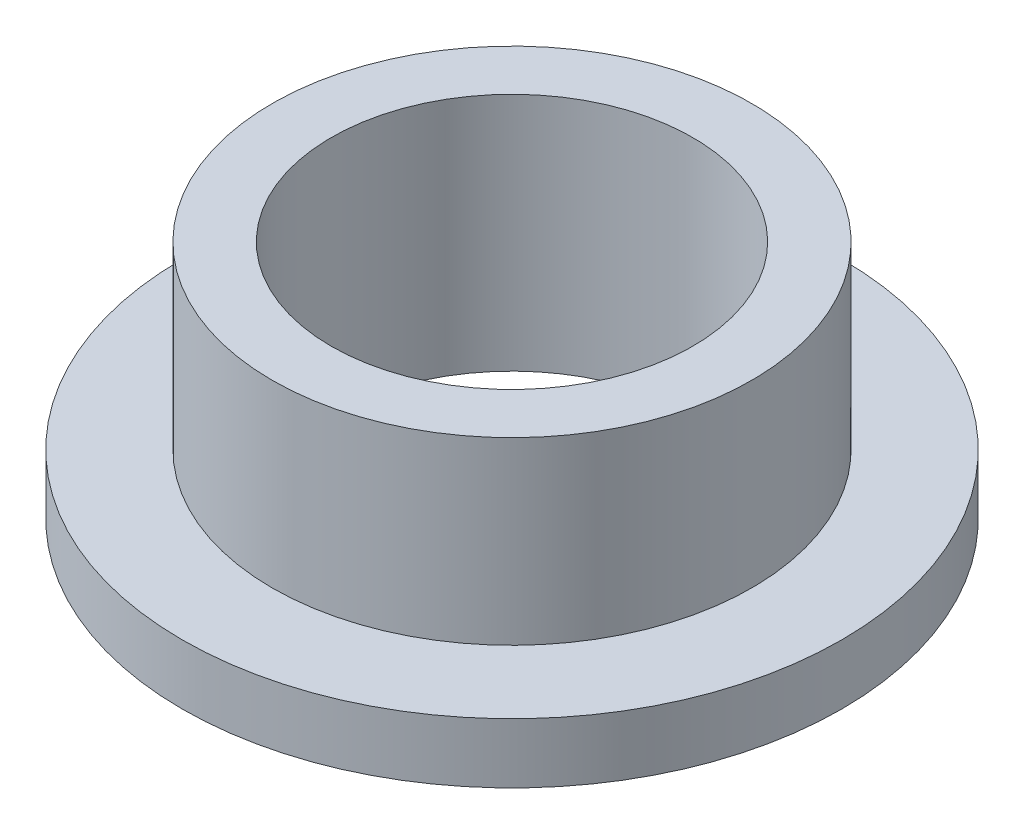
ISO-10303-21;
HEADER;
FILE_DESCRIPTION(('STEP AP214'),'2;1');
FILE_NAME('part.step','',(''),(''),'','','');
FILE_SCHEMA(('AUTOMOTIVE_DESIGN { 1 0 10303 214 1 1 1 1 }'));
ENDSEC;
DATA;
#1=APPLICATION_CONTEXT('core data for automotive mechanical design processes');
#2=APPLICATION_PROTOCOL_DEFINITION('international standard','automotive_design',2000,#1);
#3=PRODUCT_CONTEXT('',#1,'mechanical');
#4=PRODUCT('Part','Part','',(#3));
#5=PRODUCT_RELATED_PRODUCT_CATEGORY('part','',(#4));
#6=PRODUCT_DEFINITION_FORMATION('','',#4);
#7=PRODUCT_DEFINITION_CONTEXT('part definition',#1,'design');
#8=PRODUCT_DEFINITION('design','',#6,#7);
#9=PRODUCT_DEFINITION_SHAPE('','',#8);
#10=(LENGTH_UNIT() NAMED_UNIT(*) SI_UNIT(.MILLI.,.METRE.));
#11=(NAMED_UNIT(*) PLANE_ANGLE_UNIT() SI_UNIT($,.RADIAN.));
#12=(NAMED_UNIT(*) SI_UNIT($,.STERADIAN.) SOLID_ANGLE_UNIT());
#13=UNCERTAINTY_MEASURE_WITH_UNIT(LENGTH_MEASURE(1.E-05),#10,'distance_accuracy_value','');
#14=(GEOMETRIC_REPRESENTATION_CONTEXT(3) GLOBAL_UNCERTAINTY_ASSIGNED_CONTEXT((#13)) GLOBAL_UNIT_ASSIGNED_CONTEXT((#10,
#11,#12)) REPRESENTATION_CONTEXT('',''));
#15=CARTESIAN_POINT('',(0.,0.,0.));
#16=DIRECTION('',(0.,0.,1.));
#17=DIRECTION('',(1.,0.,0.));
#18=AXIS2_PLACEMENT_3D('',#15,#16,#17);
#19=CARTESIAN_POINT('',(0.,6.35,0.));
#20=DIRECTION('',(0.,1.,0.));
#21=DIRECTION('',(0.,0.,1.));
#22=AXIS2_PLACEMENT_3D('',#19,#20,#21);
#23=PLANE('',#22);
#24=CARTESIAN_POINT('',(0.,6.35,0.));
#25=DIRECTION('',(0.,1.,0.));
#26=DIRECTION('',(0.,0.,1.));
#27=AXIS2_PLACEMENT_3D('',#24,#25,#26);
#28=CIRCLE('',#27,6.35);
#29=CARTESIAN_POINT('',(0.,6.35,6.35));
#30=VERTEX_POINT('',#29);
#31=EDGE_CURVE('E10',#30,#30,#28,.T.);
#32=ORIENTED_EDGE('',*,*,#31,.T.);
#33=EDGE_LOOP('',(#32));
#34=FACE_BOUND('',#33,.T.);
#35=CARTESIAN_POINT('',(0.,6.35,0.));
#36=DIRECTION('',(0.,1.,0.));
#37=DIRECTION('',(0.,0.,1.));
#38=AXIS2_PLACEMENT_3D('',#35,#36,#37);
#39=CIRCLE('',#38,4.7879);
#40=CARTESIAN_POINT('',(0.,6.35,4.7879));
#41=VERTEX_POINT('',#40);
#42=EDGE_CURVE('E37',#41,#41,#39,.T.);
#43=ORIENTED_EDGE('',*,*,#42,.F.);
#44=EDGE_LOOP('',(#43));
#45=FACE_BOUND('',#44,.T.);
#46=ADVANCED_FACE('F30',(#34,#45),#23,.T.);
#47=CARTESIAN_POINT('',(0.,0.,0.));
#48=DIRECTION('',(0.,1.,0.));
#49=DIRECTION('',(0.,0.,1.));
#50=AXIS2_PLACEMENT_3D('',#47,#48,#49);
#51=PLANE('',#50);
#52=CARTESIAN_POINT('',(0.,0.,0.));
#53=DIRECTION('',(0.,1.,0.));
#54=DIRECTION('',(0.,0.,1.));
#55=AXIS2_PLACEMENT_3D('',#52,#53,#54);
#56=CIRCLE('',#55,4.7879);
#57=CARTESIAN_POINT('',(0.,0.,4.7879));
#58=VERTEX_POINT('',#57);
#59=EDGE_CURVE('E41',#58,#58,#56,.T.);
#60=ORIENTED_EDGE('',*,*,#59,.T.);
#61=EDGE_LOOP('',(#60));
#62=FACE_BOUND('',#61,.T.);
#63=CARTESIAN_POINT('',(0.,0.,0.));
#64=DIRECTION('',(0.,1.,0.));
#65=DIRECTION('',(0.,0.,1.));
#66=AXIS2_PLACEMENT_3D('',#63,#64,#65);
#67=CIRCLE('',#66,8.73125);
#68=CARTESIAN_POINT('',(0.,0.,8.73125));
#69=VERTEX_POINT('',#68);
#70=EDGE_CURVE('E48',#69,#69,#67,.T.);
#71=ORIENTED_EDGE('',*,*,#70,.F.);
#72=EDGE_LOOP('',(#71));
#73=FACE_BOUND('',#72,.T.);
#74=ADVANCED_FACE('F73',(#62,#73),#51,.F.);
#75=CARTESIAN_POINT('',(0.,6.35,0.));
#76=DIRECTION('',(0.,-1.,0.));
#77=DIRECTION('',(0.,0.,-1.));
#78=AXIS2_PLACEMENT_3D('',#75,#76,#77);
#79=CYLINDRICAL_SURFACE('',#78,6.35);
#80=CARTESIAN_POINT('',(0.,1.5875,0.));
#81=DIRECTION('',(0.,1.,0.));
#82=DIRECTION('',(0.,0.,1.));
#83=AXIS2_PLACEMENT_3D('',#80,#81,#82);
#84=CIRCLE('',#83,6.35);
#85=CARTESIAN_POINT('',(0.,1.5875,6.35));
#86=VERTEX_POINT('',#85);
#87=EDGE_CURVE('E51',#86,#86,#84,.T.);
#88=ORIENTED_EDGE('',*,*,#87,.T.);
#89=EDGE_LOOP('',(#88));
#90=FACE_BOUND('',#89,.T.);
#91=ORIENTED_EDGE('',*,*,#31,.F.);
#92=EDGE_LOOP('',(#91));
#93=FACE_BOUND('',#92,.T.);
#94=ADVANCED_FACE('F32',(#90,#93),#79,.T.);
#95=CARTESIAN_POINT('',(0.,6.35,0.));
#96=DIRECTION('',(0.,-1.,0.));
#97=DIRECTION('',(0.,0.,-1.));
#98=AXIS2_PLACEMENT_3D('',#95,#96,#97);
#99=CYLINDRICAL_SURFACE('',#98,4.7879);
#100=ORIENTED_EDGE('',*,*,#42,.T.);
#101=EDGE_LOOP('',(#100));
#102=FACE_BOUND('',#101,.T.);
#103=ORIENTED_EDGE('',*,*,#59,.F.);
#104=EDGE_LOOP('',(#103));
#105=FACE_BOUND('',#104,.T.);
#106=ADVANCED_FACE('F62',(#102,#105),#99,.F.);
#107=CARTESIAN_POINT('',(0.,1.5875,0.));
#108=DIRECTION('',(0.,1.,0.));
#109=DIRECTION('',(0.,0.,1.));
#110=AXIS2_PLACEMENT_3D('',#107,#108,#109);
#111=PLANE('',#110);
#112=CARTESIAN_POINT('',(0.,1.5875,0.));
#113=DIRECTION('',(0.,1.,0.));
#114=DIRECTION('',(0.,0.,1.));
#115=AXIS2_PLACEMENT_3D('',#112,#113,#114);
#116=CIRCLE('',#115,8.73125);
#117=CARTESIAN_POINT('',(0.,1.5875,8.73125));
#118=VERTEX_POINT('',#117);
#119=EDGE_CURVE('E46',#118,#118,#116,.T.);
#120=ORIENTED_EDGE('',*,*,#119,.T.);
#121=EDGE_LOOP('',(#120));
#122=FACE_BOUND('',#121,.T.);
#123=ORIENTED_EDGE('',*,*,#87,.F.);
#124=EDGE_LOOP('',(#123));
#125=FACE_BOUND('',#124,.T.);
#126=ADVANCED_FACE('F59',(#122,#125),#111,.T.);
#127=CARTESIAN_POINT('',(0.,1.5875,0.));
#128=DIRECTION('',(0.,-1.,0.));
#129=DIRECTION('',(0.,0.,-1.));
#130=AXIS2_PLACEMENT_3D('',#127,#128,#129);
#131=CYLINDRICAL_SURFACE('',#130,8.73125);
#132=ORIENTED_EDGE('',*,*,#119,.F.);
#133=EDGE_LOOP('',(#132));
#134=FACE_BOUND('',#133,.T.);
#135=ORIENTED_EDGE('',*,*,#70,.T.);
#136=EDGE_LOOP('',(#135));
#137=FACE_BOUND('',#136,.T.);
#138=ADVANCED_FACE('F61',(#134,#137),#131,.T.);
#139=CLOSED_SHELL('',(#46,#74,#94,#106,#126,#138));
#140=MANIFOLD_SOLID_BREP('B2',#139);
#141=ADVANCED_BREP_SHAPE_REPRESENTATION('',(#18,#140),#14);
#142=SHAPE_DEFINITION_REPRESENTATION(#9,#141);
ENDSEC;
END-ISO-10303-21;
